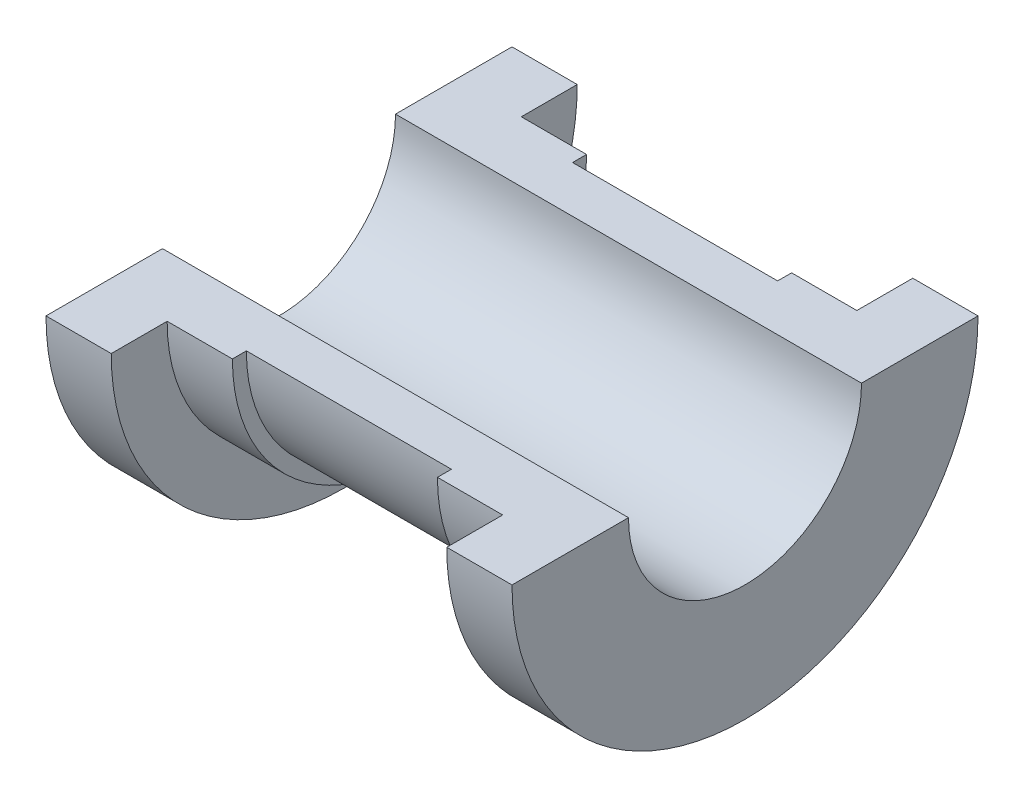
ISO-10303-21;
HEADER;
FILE_DESCRIPTION(('STEP AP214'),'2;1');
FILE_NAME('part.step','',(''),(''),'','','');
FILE_SCHEMA(('AUTOMOTIVE_DESIGN { 1 0 10303 214 1 1 1 1 }'));
ENDSEC;
DATA;
#1=APPLICATION_CONTEXT('core data for automotive mechanical design processes');
#2=APPLICATION_PROTOCOL_DEFINITION('international standard','automotive_design',2000,#1);
#3=PRODUCT_CONTEXT('',#1,'mechanical');
#4=PRODUCT('Part','Part','',(#3));
#5=PRODUCT_RELATED_PRODUCT_CATEGORY('part','',(#4));
#6=PRODUCT_DEFINITION_FORMATION('','',#4);
#7=PRODUCT_DEFINITION_CONTEXT('part definition',#1,'design');
#8=PRODUCT_DEFINITION('design','',#6,#7);
#9=PRODUCT_DEFINITION_SHAPE('','',#8);
#10=(LENGTH_UNIT() NAMED_UNIT(*) SI_UNIT(.MILLI.,.METRE.));
#11=(NAMED_UNIT(*) PLANE_ANGLE_UNIT() SI_UNIT($,.RADIAN.));
#12=(NAMED_UNIT(*) SI_UNIT($,.STERADIAN.) SOLID_ANGLE_UNIT());
#13=UNCERTAINTY_MEASURE_WITH_UNIT(LENGTH_MEASURE(1.E-05),#10,'distance_accuracy_value','');
#14=(GEOMETRIC_REPRESENTATION_CONTEXT(3) GLOBAL_UNCERTAINTY_ASSIGNED_CONTEXT((#13)) GLOBAL_UNIT_ASSIGNED_CONTEXT((#10,
#11,#12)) REPRESENTATION_CONTEXT('',''));
#15=CARTESIAN_POINT('',(0.,0.,0.));
#16=DIRECTION('',(0.,0.,1.));
#17=DIRECTION('',(1.,0.,0.));
#18=AXIS2_PLACEMENT_3D('',#15,#16,#17);
#19=CARTESIAN_POINT('',(0.,-22.5,0.));
#20=DIRECTION('',(0.,1.,0.));
#21=DIRECTION('',(0.,0.,1.));
#22=AXIS2_PLACEMENT_3D('',#19,#20,#21);
#23=CYLINDRICAL_SURFACE('',#22,3.);
#24=CARTESIAN_POINT('',(0.,-22.5,0.));
#25=DIRECTION('',(0.,1.,0.));
#26=DIRECTION('',(0.,0.,1.));
#27=AXIS2_PLACEMENT_3D('',#24,#25,#26);
#28=CIRCLE('',#27,3.);
#29=CARTESIAN_POINT('',(0.,-22.5,3.));
#30=VERTEX_POINT('',#29);
#31=EDGE_CURVE('E11',#30,#30,#28,.T.);
#32=ORIENTED_EDGE('',*,*,#31,.T.);
#33=EDGE_LOOP('',(#32));
#34=FACE_BOUND('',#33,.T.);
#35=CARTESIAN_POINT('',(0.,-17.5,0.));
#36=DIRECTION('',(0.,1.,0.));
#37=DIRECTION('',(0.,0.,1.));
#38=AXIS2_PLACEMENT_3D('',#35,#36,#37);
#39=CIRCLE('',#38,3.);
#40=CARTESIAN_POINT('',(0.,-17.5,3.));
#41=VERTEX_POINT('',#40);
#42=EDGE_CURVE('E54',#41,#41,#39,.T.);
#43=ORIENTED_EDGE('',*,*,#42,.F.);
#44=EDGE_LOOP('',(#43));
#45=FACE_BOUND('',#44,.T.);
#46=ADVANCED_FACE('F51',(#34,#45),#23,.T.);
#47=CARTESIAN_POINT('',(0.,-22.5,0.));
#48=DIRECTION('',(0.,1.,0.));
#49=DIRECTION('',(0.,0.,1.));
#50=AXIS2_PLACEMENT_3D('',#47,#48,#49);
#51=PLANE('',#50);
#52=ORIENTED_EDGE('',*,*,#31,.F.);
#53=EDGE_LOOP('',(#52));
#54=FACE_BOUND('',#53,.T.);
#55=ADVANCED_FACE('F66',(#54),#51,.F.);
#56=CARTESIAN_POINT('',(0.,-17.5,0.));
#57=DIRECTION('',(0.,1.,0.));
#58=DIRECTION('',(0.,0.,1.));
#59=AXIS2_PLACEMENT_3D('',#56,#57,#58);
#60=PLANE('',#59);
#61=ORIENTED_EDGE('',*,*,#42,.T.);
#62=EDGE_LOOP('',(#61));
#63=FACE_BOUND('',#62,.T.);
#64=ADVANCED_FACE('F63',(#63),#60,.T.);
#65=CLOSED_SHELL('',(#46,#55,#64));
#66=MANIFOLD_SOLID_BREP('B2',#65);
#67=CARTESIAN_POINT('',(25.,0.,0.));
#68=DIRECTION('',(-1.,0.,0.));
#69=DIRECTION('',(0.,0.,1.));
#70=AXIS2_PLACEMENT_3D('',#67,#68,#69);
#71=PLANE('',#70);
#72=DIRECTION('',(0.,0.,-1.));
#73=VECTOR('',#72,1.);
#74=CARTESIAN_POINT('',(25.,0.,0.));
#75=LINE('',#74,#73);
#76=CARTESIAN_POINT('',(25.,0.,25.));
#77=VERTEX_POINT('',#76);
#78=CARTESIAN_POINT('',(25.,0.,12.5));
#79=VERTEX_POINT('',#78);
#80=EDGE_CURVE('E120',#77,#79,#75,.T.);
#81=ORIENTED_EDGE('',*,*,#80,.F.);
#82=CARTESIAN_POINT('',(25.,0.,0.));
#83=DIRECTION('',(-1.,0.,0.));
#84=DIRECTION('',(0.,0.,1.));
#85=AXIS2_PLACEMENT_3D('',#82,#83,#84);
#86=CIRCLE('',#85,25.);
#87=CARTESIAN_POINT('',(25.,0.,-25.));
#88=VERTEX_POINT('',#87);
#89=EDGE_CURVE('E198',#88,#77,#86,.T.);
#90=ORIENTED_EDGE('',*,*,#89,.F.);
#91=CARTESIAN_POINT('',(25.,0.,-12.5));
#92=VERTEX_POINT('',#91);
#93=EDGE_CURVE('E197',#92,#88,#75,.T.);
#94=ORIENTED_EDGE('',*,*,#93,.F.);
#95=CARTESIAN_POINT('',(25.,0.,0.));
#96=DIRECTION('',(1.,0.,0.));
#97=DIRECTION('',(0.,0.,-1.));
#98=AXIS2_PLACEMENT_3D('',#95,#96,#97);
#99=CIRCLE('',#98,12.5);
#100=EDGE_CURVE('E187',#79,#92,#99,.T.);
#101=ORIENTED_EDGE('',*,*,#100,.F.);
#102=EDGE_LOOP('',(#81,#90,#94,#101));
#103=FACE_BOUND('',#102,.T.);
#104=ADVANCED_FACE('F98',(#103),#71,.F.);
#105=CARTESIAN_POINT('',(18.,25.,0.));
#106=DIRECTION('',(1.,0.,0.));
#107=DIRECTION('',(0.,0.,-1.));
#108=AXIS2_PLACEMENT_3D('',#105,#106,#107);
#109=PLANE('',#108);
#110=DIRECTION('',(0.,0.,1.));
#111=VECTOR('',#110,1.);
#112=CARTESIAN_POINT('',(18.,0.,0.));
#113=LINE('',#112,#111);
#114=CARTESIAN_POINT('',(18.,0.,-25.));
#115=VERTEX_POINT('',#114);
#116=CARTESIAN_POINT('',(18.,0.,-19.));
#117=VERTEX_POINT('',#116);
#118=EDGE_CURVE('E264',#115,#117,#113,.T.);
#119=ORIENTED_EDGE('',*,*,#118,.F.);
#120=CARTESIAN_POINT('',(18.,0.,0.));
#121=DIRECTION('',(-1.,0.,0.));
#122=DIRECTION('',(0.,0.,1.));
#123=AXIS2_PLACEMENT_3D('',#120,#121,#122);
#124=CIRCLE('',#123,25.);
#125=CARTESIAN_POINT('',(18.,0.,25.));
#126=VERTEX_POINT('',#125);
#127=EDGE_CURVE('E209',#115,#126,#124,.T.);
#128=ORIENTED_EDGE('',*,*,#127,.T.);
#129=CARTESIAN_POINT('',(18.,0.,19.));
#130=VERTEX_POINT('',#129);
#131=EDGE_CURVE('E194',#130,#126,#113,.T.);
#132=ORIENTED_EDGE('',*,*,#131,.F.);
#133=CARTESIAN_POINT('',(18.,0.,0.));
#134=DIRECTION('',(-1.,0.,0.));
#135=DIRECTION('',(0.,0.,1.));
#136=AXIS2_PLACEMENT_3D('',#133,#134,#135);
#137=CIRCLE('',#136,19.);
#138=EDGE_CURVE('E215',#117,#130,#137,.T.);
#139=ORIENTED_EDGE('',*,*,#138,.F.);
#140=EDGE_LOOP('',(#119,#128,#132,#139));
#141=FACE_BOUND('',#140,.T.);
#142=ADVANCED_FACE('F307',(#141),#109,.F.);
#143=CARTESIAN_POINT('',(-25.,0.,0.));
#144=DIRECTION('',(-1.,0.,0.));
#145=DIRECTION('',(0.,0.,1.));
#146=AXIS2_PLACEMENT_3D('',#143,#144,#145);
#147=CYLINDRICAL_SURFACE('',#146,19.);
#148=DIRECTION('',(-1.,0.,0.));
#149=VECTOR('',#148,1.);
#150=CARTESIAN_POINT('',(-25.,0.,-19.));
#151=LINE('',#150,#149);
#152=CARTESIAN_POINT('',(11.,0.,-19.));
#153=VERTEX_POINT('',#152);
#154=EDGE_CURVE('E268',#117,#153,#151,.T.);
#155=ORIENTED_EDGE('',*,*,#154,.F.);
#156=ORIENTED_EDGE('',*,*,#138,.T.);
#157=DIRECTION('',(-1.,0.,0.));
#158=VECTOR('',#157,1.);
#159=CARTESIAN_POINT('',(-25.,0.,19.));
#160=LINE('',#159,#158);
#161=CARTESIAN_POINT('',(11.,0.,19.));
#162=VERTEX_POINT('',#161);
#163=EDGE_CURVE('E249',#162,#130,#160,.F.);
#164=ORIENTED_EDGE('',*,*,#163,.F.);
#165=CARTESIAN_POINT('',(11.,0.,0.));
#166=DIRECTION('',(-1.,0.,0.));
#167=DIRECTION('',(0.,0.,1.));
#168=AXIS2_PLACEMENT_3D('',#165,#166,#167);
#169=CIRCLE('',#168,19.);
#170=EDGE_CURVE('E219',#153,#162,#169,.T.);
#171=ORIENTED_EDGE('',*,*,#170,.F.);
#172=EDGE_LOOP('',(#155,#156,#164,#171));
#173=FACE_BOUND('',#172,.T.);
#174=ADVANCED_FACE('F344',(#173),#147,.T.);
#175=CARTESIAN_POINT('',(11.,19.,0.));
#176=DIRECTION('',(1.,0.,0.));
#177=DIRECTION('',(0.,0.,-1.));
#178=AXIS2_PLACEMENT_3D('',#175,#176,#177);
#179=PLANE('',#178);
#180=DIRECTION('',(0.,0.,1.));
#181=VECTOR('',#180,1.);
#182=CARTESIAN_POINT('',(11.,0.,0.));
#183=LINE('',#182,#181);
#184=CARTESIAN_POINT('',(11.,0.,-17.5));
#185=VERTEX_POINT('',#184);
#186=EDGE_CURVE('E272',#153,#185,#183,.T.);
#187=ORIENTED_EDGE('',*,*,#186,.F.);
#188=ORIENTED_EDGE('',*,*,#170,.T.);
#189=CARTESIAN_POINT('',(11.,0.,17.5));
#190=VERTEX_POINT('',#189);
#191=EDGE_CURVE('E253',#190,#162,#183,.T.);
#192=ORIENTED_EDGE('',*,*,#191,.F.);
#193=CARTESIAN_POINT('',(11.,0.,0.));
#194=DIRECTION('',(-1.,0.,0.));
#195=DIRECTION('',(0.,0.,1.));
#196=AXIS2_PLACEMENT_3D('',#193,#194,#195);
#197=CIRCLE('',#196,17.5);
#198=EDGE_CURVE('E223',#185,#190,#197,.T.);
#199=ORIENTED_EDGE('',*,*,#198,.F.);
#200=EDGE_LOOP('',(#187,#188,#192,#199));
#201=FACE_BOUND('',#200,.T.);
#202=ADVANCED_FACE('F341',(#201),#179,.F.);
#203=CARTESIAN_POINT('',(-25.,0.,0.));
#204=DIRECTION('',(-1.,0.,0.));
#205=DIRECTION('',(0.,0.,1.));
#206=AXIS2_PLACEMENT_3D('',#203,#204,#205);
#207=CYLINDRICAL_SURFACE('',#206,17.5);
#208=DIRECTION('',(-1.,0.,0.));
#209=VECTOR('',#208,1.);
#210=CARTESIAN_POINT('',(-25.,0.,-17.5));
#211=LINE('',#210,#209);
#212=CARTESIAN_POINT('',(-11.,0.,-17.5));
#213=VERTEX_POINT('',#212);
#214=EDGE_CURVE('E276',#185,#213,#211,.T.);
#215=ORIENTED_EDGE('',*,*,#214,.F.);
#216=ORIENTED_EDGE('',*,*,#198,.T.);
#217=DIRECTION('',(-1.,0.,0.));
#218=VECTOR('',#217,1.);
#219=CARTESIAN_POINT('',(-25.,0.,17.5));
#220=LINE('',#219,#218);
#221=CARTESIAN_POINT('',(-11.,0.,17.5));
#222=VERTEX_POINT('',#221);
#223=EDGE_CURVE('E254',#222,#190,#220,.F.);
#224=ORIENTED_EDGE('',*,*,#223,.F.);
#225=CARTESIAN_POINT('',(-11.,0.,0.));
#226=DIRECTION('',(-1.,0.,0.));
#227=DIRECTION('',(0.,0.,1.));
#228=AXIS2_PLACEMENT_3D('',#225,#226,#227);
#229=CIRCLE('',#228,17.5);
#230=EDGE_CURVE('E227',#213,#222,#229,.T.);
#231=ORIENTED_EDGE('',*,*,#230,.F.);
#232=EDGE_LOOP('',(#215,#216,#224,#231));
#233=FACE_BOUND('',#232,.T.);
#234=ADVANCED_FACE('F338',(#233),#207,.T.);
#235=CARTESIAN_POINT('',(-11.,19.,0.));
#236=DIRECTION('',(-1.,0.,0.));
#237=DIRECTION('',(0.,0.,1.));
#238=AXIS2_PLACEMENT_3D('',#235,#236,#237);
#239=PLANE('',#238);
#240=DIRECTION('',(0.,0.,-1.));
#241=VECTOR('',#240,1.);
#242=CARTESIAN_POINT('',(-11.,0.,0.));
#243=LINE('',#242,#241);
#244=CARTESIAN_POINT('',(-11.,0.,19.));
#245=VERTEX_POINT('',#244);
#246=EDGE_CURVE('E258',#245,#222,#243,.T.);
#247=ORIENTED_EDGE('',*,*,#246,.F.);
#248=CARTESIAN_POINT('',(-11.,0.,0.));
#249=DIRECTION('',(-1.,0.,0.));
#250=DIRECTION('',(0.,0.,1.));
#251=AXIS2_PLACEMENT_3D('',#248,#249,#250);
#252=CIRCLE('',#251,19.);
#253=CARTESIAN_POINT('',(-11.,0.,-19.));
#254=VERTEX_POINT('',#253);
#255=EDGE_CURVE('E231',#254,#245,#252,.T.);
#256=ORIENTED_EDGE('',*,*,#255,.F.);
#257=EDGE_CURVE('E280',#213,#254,#243,.T.);
#258=ORIENTED_EDGE('',*,*,#257,.F.);
#259=ORIENTED_EDGE('',*,*,#230,.T.);
#260=EDGE_LOOP('',(#247,#256,#258,#259));
#261=FACE_BOUND('',#260,.T.);
#262=ADVANCED_FACE('F335',(#261),#239,.F.);
#263=CARTESIAN_POINT('',(-25.,0.,0.));
#264=DIRECTION('',(-1.,0.,0.));
#265=DIRECTION('',(0.,0.,1.));
#266=AXIS2_PLACEMENT_3D('',#263,#264,#265);
#267=CYLINDRICAL_SURFACE('',#266,19.);
#268=DIRECTION('',(-1.,0.,0.));
#269=VECTOR('',#268,1.);
#270=CARTESIAN_POINT('',(-25.,0.,-19.));
#271=LINE('',#270,#269);
#272=CARTESIAN_POINT('',(-18.,0.,-19.));
#273=VERTEX_POINT('',#272);
#274=EDGE_CURVE('E284',#254,#273,#271,.T.);
#275=ORIENTED_EDGE('',*,*,#274,.F.);
#276=ORIENTED_EDGE('',*,*,#255,.T.);
#277=DIRECTION('',(-1.,0.,0.));
#278=VECTOR('',#277,1.);
#279=CARTESIAN_POINT('',(-25.,0.,19.));
#280=LINE('',#279,#278);
#281=CARTESIAN_POINT('',(-18.,0.,19.));
#282=VERTEX_POINT('',#281);
#283=EDGE_CURVE('E259',#282,#245,#280,.F.);
#284=ORIENTED_EDGE('',*,*,#283,.F.);
#285=CARTESIAN_POINT('',(-18.,0.,0.));
#286=DIRECTION('',(-1.,0.,0.));
#287=DIRECTION('',(0.,0.,1.));
#288=AXIS2_PLACEMENT_3D('',#285,#286,#287);
#289=CIRCLE('',#288,19.);
#290=EDGE_CURVE('E235',#273,#282,#289,.T.);
#291=ORIENTED_EDGE('',*,*,#290,.F.);
#292=EDGE_LOOP('',(#275,#276,#284,#291));
#293=FACE_BOUND('',#292,.T.);
#294=ADVANCED_FACE('F333',(#293),#267,.T.);
#295=CARTESIAN_POINT('',(-18.,25.,0.));
#296=DIRECTION('',(-1.,0.,0.));
#297=DIRECTION('',(0.,0.,1.));
#298=AXIS2_PLACEMENT_3D('',#295,#296,#297);
#299=PLANE('',#298);
#300=DIRECTION('',(0.,0.,-1.));
#301=VECTOR('',#300,1.);
#302=CARTESIAN_POINT('',(-18.,0.,0.));
#303=LINE('',#302,#301);
#304=CARTESIAN_POINT('',(-18.,0.,25.));
#305=VERTEX_POINT('',#304);
#306=EDGE_CURVE('E263',#305,#282,#303,.T.);
#307=ORIENTED_EDGE('',*,*,#306,.F.);
#308=CARTESIAN_POINT('',(-18.,0.,0.));
#309=DIRECTION('',(-1.,0.,0.));
#310=DIRECTION('',(0.,0.,1.));
#311=AXIS2_PLACEMENT_3D('',#308,#309,#310);
#312=CIRCLE('',#311,25.);
#313=CARTESIAN_POINT('',(-18.,0.,-25.));
#314=VERTEX_POINT('',#313);
#315=EDGE_CURVE('E239',#314,#305,#312,.T.);
#316=ORIENTED_EDGE('',*,*,#315,.F.);
#317=EDGE_CURVE('E288',#273,#314,#303,.T.);
#318=ORIENTED_EDGE('',*,*,#317,.F.);
#319=ORIENTED_EDGE('',*,*,#290,.T.);
#320=EDGE_LOOP('',(#307,#316,#318,#319));
#321=FACE_BOUND('',#320,.T.);
#322=ADVANCED_FACE('F329',(#321),#299,.F.);
#323=CARTESIAN_POINT('',(-25.,0.,0.));
#324=DIRECTION('',(1.,0.,0.));
#325=DIRECTION('',(0.,0.,-1.));
#326=AXIS2_PLACEMENT_3D('',#323,#324,#325);
#327=PLANE('',#326);
#328=DIRECTION('',(0.,0.,1.));
#329=VECTOR('',#328,1.);
#330=CARTESIAN_POINT('',(-25.,0.,0.));
#331=LINE('',#330,#329);
#332=CARTESIAN_POINT('',(-25.,0.,-25.));
#333=VERTEX_POINT('',#332);
#334=CARTESIAN_POINT('',(-25.,0.,-12.5));
#335=VERTEX_POINT('',#334);
#336=EDGE_CURVE('E202',#333,#335,#331,.T.);
#337=ORIENTED_EDGE('',*,*,#336,.F.);
#338=CARTESIAN_POINT('',(-25.,0.,0.));
#339=DIRECTION('',(-1.,0.,0.));
#340=DIRECTION('',(0.,0.,1.));
#341=AXIS2_PLACEMENT_3D('',#338,#339,#340);
#342=CIRCLE('',#341,25.);
#343=CARTESIAN_POINT('',(-25.,0.,25.));
#344=VERTEX_POINT('',#343);
#345=EDGE_CURVE('E243',#333,#344,#342,.T.);
#346=ORIENTED_EDGE('',*,*,#345,.T.);
#347=CARTESIAN_POINT('',(-25.,0.,12.5));
#348=VERTEX_POINT('',#347);
#349=EDGE_CURVE('E201',#348,#344,#331,.T.);
#350=ORIENTED_EDGE('',*,*,#349,.F.);
#351=CARTESIAN_POINT('',(-25.,0.,0.));
#352=DIRECTION('',(1.,0.,0.));
#353=DIRECTION('',(0.,0.,-1.));
#354=AXIS2_PLACEMENT_3D('',#351,#352,#353);
#355=CIRCLE('',#354,12.5);
#356=EDGE_CURVE('E193',#348,#335,#355,.T.);
#357=ORIENTED_EDGE('',*,*,#356,.T.);
#358=EDGE_LOOP('',(#337,#346,#350,#357));
#359=FACE_BOUND('',#358,.T.);
#360=ADVANCED_FACE('F323',(#359),#327,.F.);
#361=CARTESIAN_POINT('',(-25.,0.,0.));
#362=DIRECTION('',(1.,0.,0.));
#363=DIRECTION('',(0.,0.,-1.));
#364=AXIS2_PLACEMENT_3D('',#361,#362,#363);
#365=CYLINDRICAL_SURFACE('',#364,12.5);
#366=DIRECTION('',(1.,0.,0.));
#367=VECTOR('',#366,1.);
#368=CARTESIAN_POINT('',(-25.,0.,12.5));
#369=LINE('',#368,#367);
#370=EDGE_CURVE('E49',#79,#348,#369,.F.);
#371=ORIENTED_EDGE('',*,*,#370,.F.);
#372=ORIENTED_EDGE('',*,*,#100,.T.);
#373=DIRECTION('',(1.,0.,0.));
#374=VECTOR('',#373,1.);
#375=CARTESIAN_POINT('',(-25.,0.,-12.5));
#376=LINE('',#375,#374);
#377=EDGE_CURVE('E106',#335,#92,#376,.T.);
#378=ORIENTED_EDGE('',*,*,#377,.F.);
#379=ORIENTED_EDGE('',*,*,#356,.F.);
#380=EDGE_LOOP('',(#371,#372,#378,#379));
#381=FACE_BOUND('',#380,.T.);
#382=ADVANCED_FACE('F189',(#381),#365,.F.);
#383=CARTESIAN_POINT('',(-25.,0.,0.));
#384=DIRECTION('',(-1.,0.,0.));
#385=DIRECTION('',(0.,0.,1.));
#386=AXIS2_PLACEMENT_3D('',#383,#384,#385);
#387=CYLINDRICAL_SURFACE('',#386,25.);
#388=ORIENTED_EDGE('',*,*,#89,.T.);
#389=DIRECTION('',(-1.,0.,0.));
#390=VECTOR('',#389,1.);
#391=CARTESIAN_POINT('',(133.253175473055,0.,25.));
#392=LINE('',#391,#390);
#393=EDGE_CURVE('E297',#77,#126,#392,.T.);
#394=ORIENTED_EDGE('',*,*,#393,.T.);
#395=ORIENTED_EDGE('',*,*,#127,.F.);
#396=DIRECTION('',(-1.,0.,0.));
#397=VECTOR('',#396,1.);
#398=CARTESIAN_POINT('',(133.253175473055,0.,-25.));
#399=LINE('',#398,#397);
#400=EDGE_CURVE('E113',#88,#115,#399,.T.);
#401=ORIENTED_EDGE('',*,*,#400,.F.);
#402=EDGE_LOOP('',(#388,#394,#395,#401));
#403=FACE_BOUND('',#402,.T.);
#404=ADVANCED_FACE('F303',(#403),#387,.T.);
#405=CARTESIAN_POINT('',(-25.,0.,0.));
#406=DIRECTION('',(-1.,0.,0.));
#407=DIRECTION('',(0.,0.,1.));
#408=AXIS2_PLACEMENT_3D('',#405,#406,#407);
#409=CYLINDRICAL_SURFACE('',#408,25.);
#410=ORIENTED_EDGE('',*,*,#315,.T.);
#411=EDGE_CURVE('E294',#305,#344,#392,.T.);
#412=ORIENTED_EDGE('',*,*,#411,.T.);
#413=ORIENTED_EDGE('',*,*,#345,.F.);
#414=EDGE_CURVE('E298',#314,#333,#399,.T.);
#415=ORIENTED_EDGE('',*,*,#414,.F.);
#416=EDGE_LOOP('',(#410,#412,#413,#415));
#417=FACE_BOUND('',#416,.T.);
#418=ADVANCED_FACE('F326',(#417),#409,.T.);
#419=CARTESIAN_POINT('',(133.253175473055,0.,25.));
#420=DIRECTION('',(0.,1.,0.));
#421=DIRECTION('',(0.,0.,1.));
#422=AXIS2_PLACEMENT_3D('',#419,#420,#421);
#423=PLANE('',#422);
#424=ORIENTED_EDGE('',*,*,#400,.T.);
#425=ORIENTED_EDGE('',*,*,#118,.T.);
#426=ORIENTED_EDGE('',*,*,#154,.T.);
#427=ORIENTED_EDGE('',*,*,#186,.T.);
#428=ORIENTED_EDGE('',*,*,#214,.T.);
#429=ORIENTED_EDGE('',*,*,#257,.T.);
#430=ORIENTED_EDGE('',*,*,#274,.T.);
#431=ORIENTED_EDGE('',*,*,#317,.T.);
#432=ORIENTED_EDGE('',*,*,#414,.T.);
#433=ORIENTED_EDGE('',*,*,#336,.T.);
#434=ORIENTED_EDGE('',*,*,#377,.T.);
#435=ORIENTED_EDGE('',*,*,#93,.T.);
#436=EDGE_LOOP('',(#424,#425,#426,#427,#428,#429,#430,#431,#432,#433,#434,#435));
#437=FACE_BOUND('',#436,.T.);
#438=ADVANCED_FACE('F205',(#437),#423,.T.);
#439=ORIENTED_EDGE('',*,*,#163,.T.);
#440=ORIENTED_EDGE('',*,*,#131,.T.);
#441=ORIENTED_EDGE('',*,*,#393,.F.);
#442=ORIENTED_EDGE('',*,*,#80,.T.);
#443=ORIENTED_EDGE('',*,*,#370,.T.);
#444=ORIENTED_EDGE('',*,*,#349,.T.);
#445=ORIENTED_EDGE('',*,*,#411,.F.);
#446=ORIENTED_EDGE('',*,*,#306,.T.);
#447=ORIENTED_EDGE('',*,*,#283,.T.);
#448=ORIENTED_EDGE('',*,*,#246,.T.);
#449=ORIENTED_EDGE('',*,*,#223,.T.);
#450=ORIENTED_EDGE('',*,*,#191,.T.);
#451=EDGE_LOOP('',(#439,#440,#441,#442,#443,#444,#445,#446,#447,#448,#449,#450));
#452=FACE_BOUND('',#451,.T.);
#453=ADVANCED_FACE('F309',(#452),#423,.T.);
#454=CLOSED_SHELL('',(#104,#142,#174,#202,#234,#262,#294,#322,#360,#382,#404,#418,#438,#453));
#455=MANIFOLD_SOLID_BREP('B6',#454);
#456=ADVANCED_BREP_SHAPE_REPRESENTATION('',(#18,#66,#455),#14);
#457=SHAPE_DEFINITION_REPRESENTATION(#9,#456);
ENDSEC;
END-ISO-10303-21;
